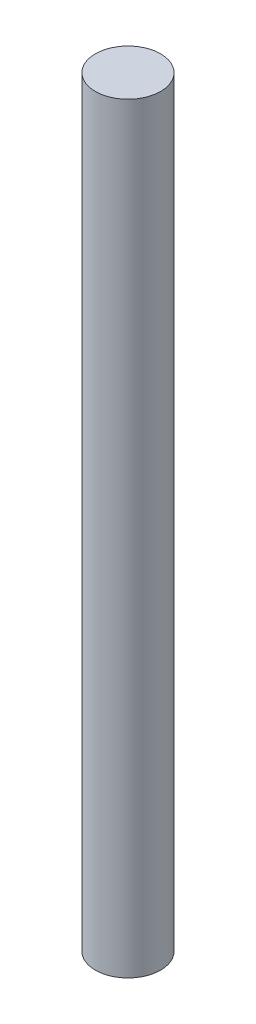
ISO-10303-21;
HEADER;
FILE_DESCRIPTION(('STEP AP214'),'2;1');
FILE_NAME('part.step','',(''),(''),'','','');
FILE_SCHEMA(('AUTOMOTIVE_DESIGN { 1 0 10303 214 1 1 1 1 }'));
ENDSEC;
DATA;
#1=APPLICATION_CONTEXT('core data for automotive mechanical design processes');
#2=APPLICATION_PROTOCOL_DEFINITION('international standard','automotive_design',2000,#1);
#3=PRODUCT_CONTEXT('',#1,'mechanical');
#4=PRODUCT('Part','Part','',(#3));
#5=PRODUCT_RELATED_PRODUCT_CATEGORY('part','',(#4));
#6=PRODUCT_DEFINITION_FORMATION('','',#4);
#7=PRODUCT_DEFINITION_CONTEXT('part definition',#1,'design');
#8=PRODUCT_DEFINITION('design','',#6,#7);
#9=PRODUCT_DEFINITION_SHAPE('','',#8);
#10=(LENGTH_UNIT() NAMED_UNIT(*) SI_UNIT(.MILLI.,.METRE.));
#11=(NAMED_UNIT(*) PLANE_ANGLE_UNIT() SI_UNIT($,.RADIAN.));
#12=(NAMED_UNIT(*) SI_UNIT($,.STERADIAN.) SOLID_ANGLE_UNIT());
#13=UNCERTAINTY_MEASURE_WITH_UNIT(LENGTH_MEASURE(1.E-05),#10,'distance_accuracy_value','');
#14=(GEOMETRIC_REPRESENTATION_CONTEXT(3) GLOBAL_UNCERTAINTY_ASSIGNED_CONTEXT((#13)) GLOBAL_UNIT_ASSIGNED_CONTEXT((#10,
#11,#12)) REPRESENTATION_CONTEXT('',''));
#15=CARTESIAN_POINT('',(0.,0.,0.));
#16=DIRECTION('',(0.,0.,1.));
#17=DIRECTION('',(1.,0.,0.));
#18=AXIS2_PLACEMENT_3D('',#15,#16,#17);
#19=CARTESIAN_POINT('',(0.,70.,0.));
#20=DIRECTION('',(0.,-1.,0.));
#21=DIRECTION('',(0.,0.,-1.));
#22=AXIS2_PLACEMENT_3D('',#19,#20,#21);
#23=CYLINDRICAL_SURFACE('',#22,3.);
#24=CARTESIAN_POINT('',(0.,70.,0.));
#25=DIRECTION('',(0.,1.,0.));
#26=DIRECTION('',(0.,0.,1.));
#27=AXIS2_PLACEMENT_3D('',#24,#25,#26);
#28=CIRCLE('',#27,3.);
#29=CARTESIAN_POINT('',(0.,70.,3.));
#30=VERTEX_POINT('',#29);
#31=EDGE_CURVE('E10',#30,#30,#28,.T.);
#32=ORIENTED_EDGE('',*,*,#31,.F.);
#33=EDGE_LOOP('',(#32));
#34=FACE_BOUND('',#33,.T.);
#35=CARTESIAN_POINT('',(0.,0.,0.));
#36=DIRECTION('',(0.,1.,0.));
#37=DIRECTION('',(0.,0.,1.));
#38=AXIS2_PLACEMENT_3D('',#35,#36,#37);
#39=CIRCLE('',#38,3.);
#40=CARTESIAN_POINT('',(0.,0.,3.));
#41=VERTEX_POINT('',#40);
#42=EDGE_CURVE('E40',#41,#41,#39,.T.);
#43=ORIENTED_EDGE('',*,*,#42,.T.);
#44=EDGE_LOOP('',(#43));
#45=FACE_BOUND('',#44,.T.);
#46=ADVANCED_FACE('F37',(#34,#45),#23,.T.);
#47=CARTESIAN_POINT('',(0.,70.,0.));
#48=DIRECTION('',(0.,1.,0.));
#49=DIRECTION('',(0.,0.,1.));
#50=AXIS2_PLACEMENT_3D('',#47,#48,#49);
#51=PLANE('',#50);
#52=ORIENTED_EDGE('',*,*,#31,.T.);
#53=EDGE_LOOP('',(#52));
#54=FACE_BOUND('',#53,.T.);
#55=ADVANCED_FACE('F54',(#54),#51,.T.);
#56=CARTESIAN_POINT('',(0.,0.,0.));
#57=DIRECTION('',(0.,1.,0.));
#58=DIRECTION('',(0.,0.,1.));
#59=AXIS2_PLACEMENT_3D('',#56,#57,#58);
#60=PLANE('',#59);
#61=ORIENTED_EDGE('',*,*,#42,.F.);
#62=EDGE_LOOP('',(#61));
#63=FACE_BOUND('',#62,.T.);
#64=ADVANCED_FACE('F52',(#63),#60,.F.);
#65=CLOSED_SHELL('',(#46,#55,#64));
#66=MANIFOLD_SOLID_BREP('B2',#65);
#67=ADVANCED_BREP_SHAPE_REPRESENTATION('',(#18,#66),#14);
#68=SHAPE_DEFINITION_REPRESENTATION(#9,#67);
ENDSEC;
END-ISO-10303-21;
